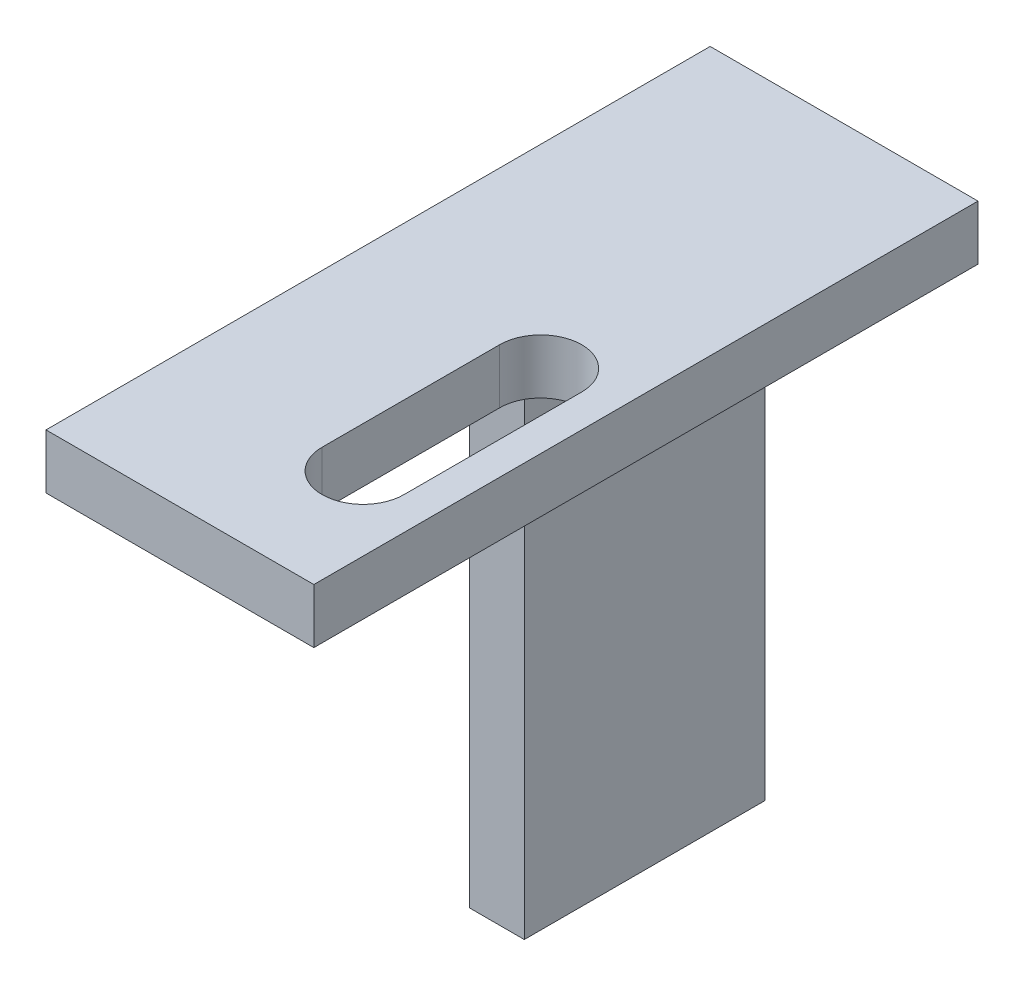
ISO-10303-21;
HEADER;
FILE_DESCRIPTION(('STEP AP214'),'2;1');
FILE_NAME('part.step','',(''),(''),'','','');
FILE_SCHEMA(('AUTOMOTIVE_DESIGN { 1 0 10303 214 1 1 1 1 }'));
ENDSEC;
DATA;
#1=APPLICATION_CONTEXT('core data for automotive mechanical design processes');
#2=APPLICATION_PROTOCOL_DEFINITION('international standard','automotive_design',2000,#1);
#3=PRODUCT_CONTEXT('',#1,'mechanical');
#4=PRODUCT('Part','Part','',(#3));
#5=PRODUCT_RELATED_PRODUCT_CATEGORY('part','',(#4));
#6=PRODUCT_DEFINITION_FORMATION('','',#4);
#7=PRODUCT_DEFINITION_CONTEXT('part definition',#1,'design');
#8=PRODUCT_DEFINITION('design','',#6,#7);
#9=PRODUCT_DEFINITION_SHAPE('','',#8);
#10=(LENGTH_UNIT() NAMED_UNIT(*) SI_UNIT(.MILLI.,.METRE.));
#11=(NAMED_UNIT(*) PLANE_ANGLE_UNIT() SI_UNIT($,.RADIAN.));
#12=(NAMED_UNIT(*) SI_UNIT($,.STERADIAN.) SOLID_ANGLE_UNIT());
#13=UNCERTAINTY_MEASURE_WITH_UNIT(LENGTH_MEASURE(1.E-05),#10,'distance_accuracy_value','');
#14=(GEOMETRIC_REPRESENTATION_CONTEXT(3) GLOBAL_UNCERTAINTY_ASSIGNED_CONTEXT((#13)) GLOBAL_UNIT_ASSIGNED_CONTEXT((#10,
#11,#12)) REPRESENTATION_CONTEXT('',''));
#15=CARTESIAN_POINT('',(0.,0.,0.));
#16=DIRECTION('',(0.,0.,1.));
#17=DIRECTION('',(1.,0.,0.));
#18=AXIS2_PLACEMENT_3D('',#15,#16,#17);
#19=CARTESIAN_POINT('',(0.,-2.,0.));
#20=DIRECTION('',(0.,1.,0.));
#21=DIRECTION('',(0.,0.,-1.));
#22=AXIS2_PLACEMENT_3D('',#19,#20,#21);
#23=PLANE('',#22);
#24=DIRECTION('',(0.,0.,1.));
#25=VECTOR('',#24,1.);
#26=CARTESIAN_POINT('',(-1.2,-2.,-4.5));
#27=LINE('',#26,#25);
#28=CARTESIAN_POINT('',(-1.2,-2.,-11.));
#29=VERTEX_POINT('',#28);
#30=CARTESIAN_POINT('',(-1.2,-2.,-4.5));
#31=VERTEX_POINT('',#30);
#32=EDGE_CURVE('E175',#29,#31,#27,.T.);
#33=ORIENTED_EDGE('',*,*,#32,.F.);
#34=CARTESIAN_POINT('',(-2.7,-2.,-11.));
#35=DIRECTION('',(0.,-1.,0.));
#36=DIRECTION('',(0.,0.,1.));
#37=AXIS2_PLACEMENT_3D('',#34,#35,#36);
#38=CIRCLE('',#37,1.5);
#39=CARTESIAN_POINT('',(-4.2,-2.,-11.));
#40=VERTEX_POINT('',#39);
#41=EDGE_CURVE('E173',#40,#29,#38,.T.);
#42=ORIENTED_EDGE('',*,*,#41,.F.);
#43=DIRECTION('',(0.,0.,-1.));
#44=VECTOR('',#43,1.);
#45=CARTESIAN_POINT('',(-4.2,-2.,-4.5));
#46=LINE('',#45,#44);
#47=CARTESIAN_POINT('',(-4.2,-2.,-4.5));
#48=VERTEX_POINT('',#47);
#49=EDGE_CURVE('E170',#48,#40,#46,.T.);
#50=ORIENTED_EDGE('',*,*,#49,.F.);
#51=CARTESIAN_POINT('',(-2.7,-2.,-4.5));
#52=DIRECTION('',(0.,-1.,0.));
#53=DIRECTION('',(0.,0.,-1.));
#54=AXIS2_PLACEMENT_3D('',#51,#52,#53);
#55=CIRCLE('',#54,1.5);
#56=EDGE_CURVE('E167',#31,#48,#55,.T.);
#57=ORIENTED_EDGE('',*,*,#56,.F.);
#58=EDGE_LOOP('',(#33,#42,#50,#57));
#59=FACE_BOUND('',#58,.T.);
#60=DIRECTION('',(0.,0.,-1.));
#61=VECTOR('',#60,1.);
#62=CARTESIAN_POINT('',(-7.8,-2.,-24.3));
#63=LINE('',#62,#61);
#64=CARTESIAN_POINT('',(-7.8,-2.,-11.7889662689289));
#65=VERTEX_POINT('',#64);
#66=CARTESIAN_POINT('',(-7.8,-2.,-24.3));
#67=VERTEX_POINT('',#66);
#68=EDGE_CURVE('E144',#65,#67,#63,.T.);
#69=ORIENTED_EDGE('',*,*,#68,.T.);
#70=DIRECTION('',(1.,0.,0.));
#71=VECTOR('',#70,1.);
#72=CARTESIAN_POINT('',(-9.8,-2.,-24.3));
#73=LINE('',#72,#71);
#74=CARTESIAN_POINT('',(0.,-2.,-24.3));
#75=VERTEX_POINT('',#74);
#76=EDGE_CURVE('E203',#67,#75,#73,.T.);
#77=ORIENTED_EDGE('',*,*,#76,.T.);
#78=DIRECTION('',(0.,0.,1.));
#79=VECTOR('',#78,1.);
#80=CARTESIAN_POINT('',(0.,-2.,0.));
#81=LINE('',#80,#79);
#82=CARTESIAN_POINT('',(0.,-2.,0.));
#83=VERTEX_POINT('',#82);
#84=EDGE_CURVE('E196',#75,#83,#81,.T.);
#85=ORIENTED_EDGE('',*,*,#84,.T.);
#86=DIRECTION('',(-1.,0.,0.));
#87=VECTOR('',#86,1.);
#88=CARTESIAN_POINT('',(0.,-2.,0.));
#89=LINE('',#88,#87);
#90=CARTESIAN_POINT('',(-9.8,-2.,0.));
#91=VERTEX_POINT('',#90);
#92=EDGE_CURVE('E199',#83,#91,#89,.T.);
#93=ORIENTED_EDGE('',*,*,#92,.T.);
#94=DIRECTION('',(0.,0.,-1.));
#95=VECTOR('',#94,1.);
#96=CARTESIAN_POINT('',(-9.8,-2.,0.));
#97=LINE('',#96,#95);
#98=CARTESIAN_POINT('',(-9.8,-2.,-11.7889662689289));
#99=VERTEX_POINT('',#98);
#100=EDGE_CURVE('E147',#91,#99,#97,.T.);
#101=ORIENTED_EDGE('',*,*,#100,.T.);
#102=DIRECTION('',(-1.,0.,0.));
#103=VECTOR('',#102,1.);
#104=CARTESIAN_POINT('',(-7.8,-2.,-11.7889662689289));
#105=LINE('',#104,#103);
#106=EDGE_CURVE('E134',#65,#99,#105,.T.);
#107=ORIENTED_EDGE('',*,*,#106,.F.);
#108=EDGE_LOOP('',(#69,#77,#85,#93,#101,#107));
#109=FACE_BOUND('',#108,.T.);
#110=ADVANCED_FACE('F37',(#59,#109),#23,.F.);
#111=CARTESIAN_POINT('',(0.,-2.,-15.5));
#112=DIRECTION('',(1.,0.,0.));
#113=DIRECTION('',(0.,0.,1.));
#114=AXIS2_PLACEMENT_3D('',#111,#112,#113);
#115=PLANE('',#114);
#116=DIRECTION('',(0.,0.,1.));
#117=VECTOR('',#116,1.);
#118=CARTESIAN_POINT('',(0.,0.,-15.5));
#119=LINE('',#118,#117);
#120=CARTESIAN_POINT('',(0.,0.,-24.3));
#121=VERTEX_POINT('',#120);
#122=CARTESIAN_POINT('',(0.,0.,0.));
#123=VERTEX_POINT('',#122);
#124=EDGE_CURVE('E200',#121,#123,#119,.T.);
#125=ORIENTED_EDGE('',*,*,#124,.T.);
#126=DIRECTION('',(0.,1.,0.));
#127=VECTOR('',#126,1.);
#128=CARTESIAN_POINT('',(0.,-2.,0.));
#129=LINE('',#128,#127);
#130=EDGE_CURVE('E41',#83,#123,#129,.T.);
#131=ORIENTED_EDGE('',*,*,#130,.F.);
#132=ORIENTED_EDGE('',*,*,#84,.F.);
#133=DIRECTION('',(0.,1.,0.));
#134=VECTOR('',#133,1.);
#135=CARTESIAN_POINT('',(0.,-2.,-24.3));
#136=LINE('',#135,#134);
#137=EDGE_CURVE('E11',#75,#121,#136,.T.);
#138=ORIENTED_EDGE('',*,*,#137,.T.);
#139=EDGE_LOOP('',(#125,#131,#132,#138));
#140=FACE_BOUND('',#139,.T.);
#141=ADVANCED_FACE('F223',(#140),#115,.T.);
#142=CARTESIAN_POINT('',(-9.8,-2.,-24.3));
#143=DIRECTION('',(0.,0.,-1.));
#144=DIRECTION('',(1.,0.,0.));
#145=AXIS2_PLACEMENT_3D('',#142,#143,#144);
#146=PLANE('',#145);
#147=DIRECTION('',(1.,0.,0.));
#148=VECTOR('',#147,1.);
#149=CARTESIAN_POINT('',(-9.8,0.,-24.3));
#150=LINE('',#149,#148);
#151=CARTESIAN_POINT('',(-9.8,0.,-24.3));
#152=VERTEX_POINT('',#151);
#153=EDGE_CURVE('E208',#152,#121,#150,.T.);
#154=ORIENTED_EDGE('',*,*,#153,.T.);
#155=ORIENTED_EDGE('',*,*,#137,.F.);
#156=ORIENTED_EDGE('',*,*,#76,.F.);
#157=DIRECTION('',(0.,1.,0.));
#158=VECTOR('',#157,1.);
#159=CARTESIAN_POINT('',(-7.8,-22.9,-24.3));
#160=LINE('',#159,#158);
#161=CARTESIAN_POINT('',(-7.8,-22.9,-24.3));
#162=VERTEX_POINT('',#161);
#163=EDGE_CURVE('E54',#162,#67,#160,.T.);
#164=ORIENTED_EDGE('',*,*,#163,.F.);
#165=DIRECTION('',(-1.,0.,0.));
#166=VECTOR('',#165,1.);
#167=CARTESIAN_POINT('',(-9.8,-22.9,-24.3));
#168=LINE('',#167,#166);
#169=CARTESIAN_POINT('',(-9.8,-22.9,-24.3));
#170=VERTEX_POINT('',#169);
#171=EDGE_CURVE('E158',#162,#170,#168,.T.);
#172=ORIENTED_EDGE('',*,*,#171,.T.);
#173=DIRECTION('',(0.,1.,0.));
#174=VECTOR('',#173,1.);
#175=CARTESIAN_POINT('',(-9.8,-2.,-24.3));
#176=LINE('',#175,#174);
#177=EDGE_CURVE('E46',#170,#152,#176,.T.);
#178=ORIENTED_EDGE('',*,*,#177,.T.);
#179=EDGE_LOOP('',(#154,#155,#156,#164,#172,#178));
#180=FACE_BOUND('',#179,.T.);
#181=ADVANCED_FACE('F231',(#180),#146,.T.);
#182=CARTESIAN_POINT('',(-9.8,-2.,-15.5));
#183=DIRECTION('',(-1.,0.,0.));
#184=DIRECTION('',(0.,0.,-1.));
#185=AXIS2_PLACEMENT_3D('',#182,#183,#184);
#186=PLANE('',#185);
#187=ORIENTED_EDGE('',*,*,#100,.F.);
#188=DIRECTION('',(0.,1.,0.));
#189=VECTOR('',#188,1.);
#190=CARTESIAN_POINT('',(-9.8,-2.,0.));
#191=LINE('',#190,#189);
#192=CARTESIAN_POINT('',(-9.8,0.,0.));
#193=VERTEX_POINT('',#192);
#194=EDGE_CURVE('E213',#91,#193,#191,.T.);
#195=ORIENTED_EDGE('',*,*,#194,.T.);
#196=DIRECTION('',(0.,0.,-1.));
#197=VECTOR('',#196,1.);
#198=CARTESIAN_POINT('',(-9.8,0.,-15.5));
#199=LINE('',#198,#197);
#200=EDGE_CURVE('E206',#193,#152,#199,.T.);
#201=ORIENTED_EDGE('',*,*,#200,.T.);
#202=ORIENTED_EDGE('',*,*,#177,.F.);
#203=DIRECTION('',(0.,0.,1.));
#204=VECTOR('',#203,1.);
#205=CARTESIAN_POINT('',(-9.8,-22.9,-24.3));
#206=LINE('',#205,#204);
#207=CARTESIAN_POINT('',(-9.79999999999999,-22.9,-15.5));
#208=VERTEX_POINT('',#207);
#209=EDGE_CURVE('E150',#170,#208,#206,.T.);
#210=ORIENTED_EDGE('',*,*,#209,.T.);
#211=DIRECTION('',(0.,1.,0.));
#212=VECTOR('',#211,1.);
#213=CARTESIAN_POINT('',(-9.79999999999999,-22.9,-15.5));
#214=LINE('',#213,#212);
#215=CARTESIAN_POINT('',(-9.8,-5.71103373107107,-15.5));
#216=VERTEX_POINT('',#215);
#217=EDGE_CURVE('E163',#208,#216,#214,.T.);
#218=ORIENTED_EDGE('',*,*,#217,.T.);
#219=DIRECTION('',(0.,-0.707106781186547,-0.707106781186547));
#220=VECTOR('',#219,1.);
#221=CARTESIAN_POINT('',(-9.8,-2.,-11.7889662689289));
#222=LINE('',#221,#220);
#223=EDGE_CURVE('E139',#99,#216,#222,.T.);
#224=ORIENTED_EDGE('',*,*,#223,.F.);
#225=EDGE_LOOP('',(#187,#195,#201,#202,#210,#218,#224));
#226=FACE_BOUND('',#225,.T.);
#227=ADVANCED_FACE('F228',(#226),#186,.T.);
#228=CARTESIAN_POINT('',(0.,-2.,0.));
#229=DIRECTION('',(0.,0.,1.));
#230=DIRECTION('',(-1.,0.,0.));
#231=AXIS2_PLACEMENT_3D('',#228,#229,#230);
#232=PLANE('',#231);
#233=DIRECTION('',(-1.,0.,0.));
#234=VECTOR('',#233,1.);
#235=CARTESIAN_POINT('',(0.,0.,0.));
#236=LINE('',#235,#234);
#237=EDGE_CURVE('E191',#123,#193,#236,.T.);
#238=ORIENTED_EDGE('',*,*,#237,.T.);
#239=ORIENTED_EDGE('',*,*,#194,.F.);
#240=ORIENTED_EDGE('',*,*,#92,.F.);
#241=ORIENTED_EDGE('',*,*,#130,.T.);
#242=EDGE_LOOP('',(#238,#239,#240,#241));
#243=FACE_BOUND('',#242,.T.);
#244=ADVANCED_FACE('F39',(#243),#232,.T.);
#245=CARTESIAN_POINT('',(0.,0.,0.));
#246=DIRECTION('',(0.,1.,0.));
#247=DIRECTION('',(0.,0.,-1.));
#248=AXIS2_PLACEMENT_3D('',#245,#246,#247);
#249=PLANE('',#248);
#250=CARTESIAN_POINT('',(-2.7,0.,-4.5));
#251=DIRECTION('',(0.,-1.,0.));
#252=DIRECTION('',(0.,0.,-1.));
#253=AXIS2_PLACEMENT_3D('',#250,#251,#252);
#254=CIRCLE('',#253,1.5);
#255=CARTESIAN_POINT('',(-1.2,0.,-4.5));
#256=VERTEX_POINT('',#255);
#257=CARTESIAN_POINT('',(-4.2,0.,-4.5));
#258=VERTEX_POINT('',#257);
#259=EDGE_CURVE('E166',#256,#258,#254,.T.);
#260=ORIENTED_EDGE('',*,*,#259,.T.);
#261=DIRECTION('',(0.,0.,-1.));
#262=VECTOR('',#261,1.);
#263=CARTESIAN_POINT('',(-4.2,0.,-4.5));
#264=LINE('',#263,#262);
#265=CARTESIAN_POINT('',(-4.2,0.,-11.));
#266=VERTEX_POINT('',#265);
#267=EDGE_CURVE('E181',#258,#266,#264,.T.);
#268=ORIENTED_EDGE('',*,*,#267,.T.);
#269=CARTESIAN_POINT('',(-2.7,0.,-11.));
#270=DIRECTION('',(0.,-1.,0.));
#271=DIRECTION('',(0.,0.,1.));
#272=AXIS2_PLACEMENT_3D('',#269,#270,#271);
#273=CIRCLE('',#272,1.5);
#274=CARTESIAN_POINT('',(-1.2,0.,-11.));
#275=VERTEX_POINT('',#274);
#276=EDGE_CURVE('E184',#266,#275,#273,.T.);
#277=ORIENTED_EDGE('',*,*,#276,.T.);
#278=DIRECTION('',(0.,0.,1.));
#279=VECTOR('',#278,1.);
#280=CARTESIAN_POINT('',(-1.2,0.,-4.5));
#281=LINE('',#280,#279);
#282=EDGE_CURVE('E171',#275,#256,#281,.T.);
#283=ORIENTED_EDGE('',*,*,#282,.T.);
#284=EDGE_LOOP('',(#260,#268,#277,#283));
#285=FACE_BOUND('',#284,.T.);
#286=ORIENTED_EDGE('',*,*,#124,.F.);
#287=ORIENTED_EDGE('',*,*,#153,.F.);
#288=ORIENTED_EDGE('',*,*,#200,.F.);
#289=ORIENTED_EDGE('',*,*,#237,.F.);
#290=EDGE_LOOP('',(#286,#287,#288,#289));
#291=FACE_BOUND('',#290,.T.);
#292=ADVANCED_FACE('F226',(#285,#291),#249,.T.);
#293=CARTESIAN_POINT('',(-2.7,-2.,-4.5));
#294=DIRECTION('',(0.,1.,0.));
#295=DIRECTION('',(0.,0.,-1.));
#296=AXIS2_PLACEMENT_3D('',#293,#294,#295);
#297=CYLINDRICAL_SURFACE('',#296,1.5);
#298=ORIENTED_EDGE('',*,*,#259,.F.);
#299=DIRECTION('',(0.,1.,0.));
#300=VECTOR('',#299,1.);
#301=CARTESIAN_POINT('',(-1.2,-2.,-4.5));
#302=LINE('',#301,#300);
#303=EDGE_CURVE('E189',#31,#256,#302,.T.);
#304=ORIENTED_EDGE('',*,*,#303,.F.);
#305=ORIENTED_EDGE('',*,*,#56,.T.);
#306=DIRECTION('',(0.,1.,0.));
#307=VECTOR('',#306,1.);
#308=CARTESIAN_POINT('',(-4.2,-2.,-4.5));
#309=LINE('',#308,#307);
#310=EDGE_CURVE('E178',#48,#258,#309,.T.);
#311=ORIENTED_EDGE('',*,*,#310,.T.);
#312=EDGE_LOOP('',(#298,#304,#305,#311));
#313=FACE_BOUND('',#312,.T.);
#314=ADVANCED_FACE('F260',(#313),#297,.F.);
#315=CARTESIAN_POINT('',(-1.2,-2.,-4.5));
#316=DIRECTION('',(1.,0.,0.));
#317=DIRECTION('',(0.,0.,1.));
#318=AXIS2_PLACEMENT_3D('',#315,#316,#317);
#319=PLANE('',#318);
#320=ORIENTED_EDGE('',*,*,#282,.F.);
#321=DIRECTION('',(0.,1.,0.));
#322=VECTOR('',#321,1.);
#323=CARTESIAN_POINT('',(-1.2,-2.,-11.));
#324=LINE('',#323,#322);
#325=EDGE_CURVE('E192',#29,#275,#324,.T.);
#326=ORIENTED_EDGE('',*,*,#325,.F.);
#327=ORIENTED_EDGE('',*,*,#32,.T.);
#328=ORIENTED_EDGE('',*,*,#303,.T.);
#329=EDGE_LOOP('',(#320,#326,#327,#328));
#330=FACE_BOUND('',#329,.T.);
#331=ADVANCED_FACE('F282',(#330),#319,.F.);
#332=CARTESIAN_POINT('',(-2.7,-2.,-11.));
#333=DIRECTION('',(0.,1.,0.));
#334=DIRECTION('',(0.,0.,-1.));
#335=AXIS2_PLACEMENT_3D('',#332,#333,#334);
#336=CYLINDRICAL_SURFACE('',#335,1.5);
#337=ORIENTED_EDGE('',*,*,#276,.F.);
#338=DIRECTION('',(0.,1.,0.));
#339=VECTOR('',#338,1.);
#340=CARTESIAN_POINT('',(-4.2,-2.,-11.));
#341=LINE('',#340,#339);
#342=EDGE_CURVE('E62',#40,#266,#341,.T.);
#343=ORIENTED_EDGE('',*,*,#342,.F.);
#344=ORIENTED_EDGE('',*,*,#41,.T.);
#345=ORIENTED_EDGE('',*,*,#325,.T.);
#346=EDGE_LOOP('',(#337,#343,#344,#345));
#347=FACE_BOUND('',#346,.T.);
#348=ADVANCED_FACE('F289',(#347),#336,.F.);
#349=CARTESIAN_POINT('',(-4.2,-2.,-4.5));
#350=DIRECTION('',(-1.,0.,0.));
#351=DIRECTION('',(0.,0.,-1.));
#352=AXIS2_PLACEMENT_3D('',#349,#350,#351);
#353=PLANE('',#352);
#354=ORIENTED_EDGE('',*,*,#267,.F.);
#355=ORIENTED_EDGE('',*,*,#310,.F.);
#356=ORIENTED_EDGE('',*,*,#49,.T.);
#357=ORIENTED_EDGE('',*,*,#342,.T.);
#358=EDGE_LOOP('',(#354,#355,#356,#357));
#359=FACE_BOUND('',#358,.T.);
#360=ADVANCED_FACE('F297',(#359),#353,.F.);
#361=CARTESIAN_POINT('',(-9.79999999999999,-22.9,-15.5));
#362=DIRECTION('',(0.,0.,-1.));
#363=DIRECTION('',(1.,0.,0.));
#364=AXIS2_PLACEMENT_3D('',#361,#362,#363);
#365=PLANE('',#364);
#366=ORIENTED_EDGE('',*,*,#217,.F.);
#367=DIRECTION('',(1.,0.,0.));
#368=VECTOR('',#367,1.);
#369=CARTESIAN_POINT('',(-9.79999999999999,-22.9,-15.5));
#370=LINE('',#369,#368);
#371=CARTESIAN_POINT('',(-7.8,-22.9,-15.5));
#372=VERTEX_POINT('',#371);
#373=EDGE_CURVE('E153',#208,#372,#370,.T.);
#374=ORIENTED_EDGE('',*,*,#373,.T.);
#375=DIRECTION('',(0.,1.,0.));
#376=VECTOR('',#375,1.);
#377=CARTESIAN_POINT('',(-7.8,-22.9,-15.5));
#378=LINE('',#377,#376);
#379=CARTESIAN_POINT('',(-7.8,-5.71103373107107,-15.5));
#380=VERTEX_POINT('',#379);
#381=EDGE_CURVE('E161',#372,#380,#378,.T.);
#382=ORIENTED_EDGE('',*,*,#381,.T.);
#383=DIRECTION('',(-1.,0.,0.));
#384=VECTOR('',#383,1.);
#385=CARTESIAN_POINT('',(-7.8,-5.71103373107107,-15.5));
#386=LINE('',#385,#384);
#387=EDGE_CURVE('E136',#380,#216,#386,.T.);
#388=ORIENTED_EDGE('',*,*,#387,.T.);
#389=EDGE_LOOP('',(#366,#374,#382,#388));
#390=FACE_BOUND('',#389,.T.);
#391=ADVANCED_FACE('F240',(#390),#365,.F.);
#392=CARTESIAN_POINT('',(-7.8,-22.9,-24.3));
#393=DIRECTION('',(-1.,0.,0.));
#394=DIRECTION('',(0.,0.,-1.));
#395=AXIS2_PLACEMENT_3D('',#392,#393,#394);
#396=PLANE('',#395);
#397=ORIENTED_EDGE('',*,*,#68,.F.);
#398=DIRECTION('',(0.,-0.707106781186547,-0.707106781186547));
#399=VECTOR('',#398,1.);
#400=CARTESIAN_POINT('',(-7.8,-2.,-11.7889662689289));
#401=LINE('',#400,#399);
#402=EDGE_CURVE('E130',#65,#380,#401,.T.);
#403=ORIENTED_EDGE('',*,*,#402,.T.);
#404=ORIENTED_EDGE('',*,*,#381,.F.);
#405=DIRECTION('',(0.,0.,-1.));
#406=VECTOR('',#405,1.);
#407=CARTESIAN_POINT('',(-7.8,-22.9,-24.3));
#408=LINE('',#407,#406);
#409=EDGE_CURVE('E234',#372,#162,#408,.T.);
#410=ORIENTED_EDGE('',*,*,#409,.T.);
#411=ORIENTED_EDGE('',*,*,#163,.T.);
#412=EDGE_LOOP('',(#397,#403,#404,#410,#411));
#413=FACE_BOUND('',#412,.T.);
#414=ADVANCED_FACE('F149',(#413),#396,.F.);
#415=CARTESIAN_POINT('',(0.,-22.9,0.));
#416=DIRECTION('',(0.,-1.,0.));
#417=DIRECTION('',(0.,0.,1.));
#418=AXIS2_PLACEMENT_3D('',#415,#416,#417);
#419=PLANE('',#418);
#420=ORIENTED_EDGE('',*,*,#209,.F.);
#421=ORIENTED_EDGE('',*,*,#171,.F.);
#422=ORIENTED_EDGE('',*,*,#409,.F.);
#423=ORIENTED_EDGE('',*,*,#373,.F.);
#424=EDGE_LOOP('',(#420,#421,#422,#423));
#425=FACE_BOUND('',#424,.T.);
#426=ADVANCED_FACE('F241',(#425),#419,.T.);
#427=CARTESIAN_POINT('',(-7.8,-2.,-11.7889662689289));
#428=DIRECTION('',(0.,-0.707106781186547,0.707106781186547));
#429=DIRECTION('',(0.,0.707106781186548,0.707106781186548));
#430=AXIS2_PLACEMENT_3D('',#427,#428,#429);
#431=PLANE('',#430);
#432=ORIENTED_EDGE('',*,*,#223,.T.);
#433=ORIENTED_EDGE('',*,*,#387,.F.);
#434=ORIENTED_EDGE('',*,*,#402,.F.);
#435=ORIENTED_EDGE('',*,*,#106,.T.);
#436=EDGE_LOOP('',(#432,#433,#434,#435));
#437=FACE_BOUND('',#436,.T.);
#438=ADVANCED_FACE('F133',(#437),#431,.T.);
#439=CLOSED_SHELL('',(#110,#141,#181,#227,#244,#292,#314,#331,#348,#360,#391,#414,#426,#438));
#440=MANIFOLD_SOLID_BREP('B2',#439);
#441=ADVANCED_BREP_SHAPE_REPRESENTATION('',(#18,#440),#14);
#442=SHAPE_DEFINITION_REPRESENTATION(#9,#441);
ENDSEC;
END-ISO-10303-21;
